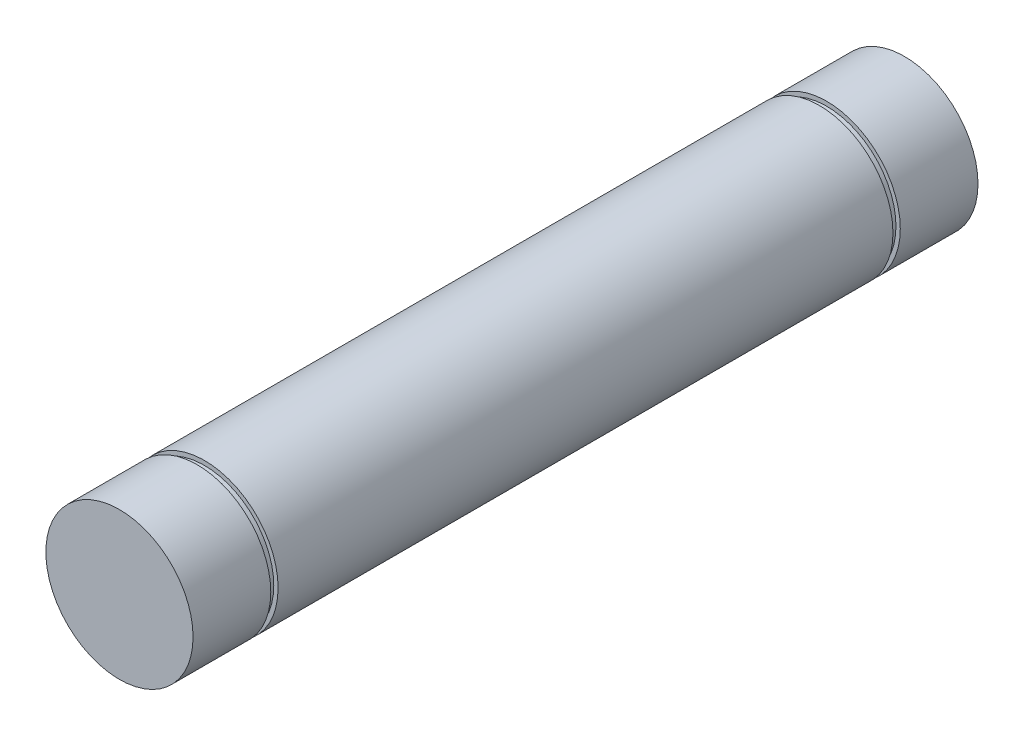
ISO-10303-21;
HEADER;
FILE_DESCRIPTION(('STEP AP214'),'2;1');
FILE_NAME('part.step','',(''),(''),'','','');
FILE_SCHEMA(('AUTOMOTIVE_DESIGN { 1 0 10303 214 1 1 1 1 }'));
ENDSEC;
DATA;
#1=APPLICATION_CONTEXT('core data for automotive mechanical design processes');
#2=APPLICATION_PROTOCOL_DEFINITION('international standard','automotive_design',2000,#1);
#3=PRODUCT_CONTEXT('',#1,'mechanical');
#4=PRODUCT('Part','Part','',(#3));
#5=PRODUCT_RELATED_PRODUCT_CATEGORY('part','',(#4));
#6=PRODUCT_DEFINITION_FORMATION('','',#4);
#7=PRODUCT_DEFINITION_CONTEXT('part definition',#1,'design');
#8=PRODUCT_DEFINITION('design','',#6,#7);
#9=PRODUCT_DEFINITION_SHAPE('','',#8);
#10=(LENGTH_UNIT() NAMED_UNIT(*) SI_UNIT(.MILLI.,.METRE.));
#11=(NAMED_UNIT(*) PLANE_ANGLE_UNIT() SI_UNIT($,.RADIAN.));
#12=(NAMED_UNIT(*) SI_UNIT($,.STERADIAN.) SOLID_ANGLE_UNIT());
#13=UNCERTAINTY_MEASURE_WITH_UNIT(LENGTH_MEASURE(1.E-05),#10,'distance_accuracy_value','');
#14=(GEOMETRIC_REPRESENTATION_CONTEXT(3) GLOBAL_UNCERTAINTY_ASSIGNED_CONTEXT((#13)) GLOBAL_UNIT_ASSIGNED_CONTEXT((#10,
#11,#12)) REPRESENTATION_CONTEXT('',''));
#15=CARTESIAN_POINT('',(0.,0.,0.));
#16=DIRECTION('',(0.,0.,1.));
#17=DIRECTION('',(1.,0.,0.));
#18=AXIS2_PLACEMENT_3D('',#15,#16,#17);
#19=CARTESIAN_POINT('',(0.,0.,-76.2));
#20=DIRECTION('',(0.,0.,1.));
#21=DIRECTION('',(1.,0.,0.));
#22=AXIS2_PLACEMENT_3D('',#19,#20,#21);
#23=CYLINDRICAL_SURFACE('',#22,14.29004);
#24=CARTESIAN_POINT('',(0.,0.,59.69));
#25=DIRECTION('',(0.,0.,1.));
#26=DIRECTION('',(1.,0.,0.));
#27=AXIS2_PLACEMENT_3D('',#24,#25,#26);
#28=CIRCLE('',#27,14.29004);
#29=CARTESIAN_POINT('',(14.29004,0.,59.69));
#30=VERTEX_POINT('',#29);
#31=EDGE_CURVE('E57',#30,#30,#28,.T.);
#32=CARTESIAN_POINT('',(0.,0.,-59.69));
#33=DIRECTION('',(0.,0.,1.));
#34=DIRECTION('',(1.,0.,0.));
#35=AXIS2_PLACEMENT_3D('',#32,#33,#34);
#36=CIRCLE('',#35,14.29004);
#37=CARTESIAN_POINT('',(14.29004,0.,-59.69));
#38=VERTEX_POINT('',#37);
#39=EDGE_CURVE('E69',#38,#38,#36,.T.);
#40=CARTESIAN_POINT('',(14.29004,0.,59.69));
#41=CARTESIAN_POINT('',(14.29004,0.,58.4464583333333));
#42=CARTESIAN_POINT('',(14.29004,0.,57.2029166666667));
#43=CARTESIAN_POINT('',(14.29004,0.,54.7158333333333));
#44=CARTESIAN_POINT('',(14.29004,0.,53.4722916666666));
#45=CARTESIAN_POINT('',(14.29004,0.,50.9852083333333));
#46=CARTESIAN_POINT('',(14.29004,0.,49.7416666666666));
#47=CARTESIAN_POINT('',(14.29004,0.,47.2545833333333));
#48=CARTESIAN_POINT('',(14.29004,0.,46.0110416666667));
#49=CARTESIAN_POINT('',(14.29004,0.,43.5239583333333));
#50=CARTESIAN_POINT('',(14.29004,0.,42.2804166666667));
#51=CARTESIAN_POINT('',(14.29004,0.,39.7933333333333));
#52=CARTESIAN_POINT('',(14.29004,0.,38.5497916666666));
#53=CARTESIAN_POINT('',(14.29004,0.,36.0627083333333));
#54=CARTESIAN_POINT('',(14.29004,0.,34.8191666666667));
#55=CARTESIAN_POINT('',(14.29004,0.,32.3320833333333));
#56=CARTESIAN_POINT('',(14.29004,0.,31.0885416666667));
#57=CARTESIAN_POINT('',(14.29004,0.,28.6014583333333));
#58=CARTESIAN_POINT('',(14.29004,0.,27.3579166666667));
#59=CARTESIAN_POINT('',(14.29004,0.,24.8708333333333));
#60=CARTESIAN_POINT('',(14.29004,0.,23.6272916666667));
#61=CARTESIAN_POINT('',(14.29004,0.,21.1402083333333));
#62=CARTESIAN_POINT('',(14.29004,0.,19.8966666666667));
#63=CARTESIAN_POINT('',(14.29004,0.,17.4095833333333));
#64=CARTESIAN_POINT('',(14.29004,0.,16.1660416666667));
#65=CARTESIAN_POINT('',(14.29004,0.,13.6789583333333));
#66=CARTESIAN_POINT('',(14.29004,0.,12.4354166666667));
#67=CARTESIAN_POINT('',(14.29004,0.,9.94833333333332));
#68=CARTESIAN_POINT('',(14.29004,0.,8.70479166666666));
#69=CARTESIAN_POINT('',(14.29004,0.,6.21770833333332));
#70=CARTESIAN_POINT('',(14.29004,0.,4.97416666666665));
#71=CARTESIAN_POINT('',(14.29004,0.,2.48708333333332));
#72=CARTESIAN_POINT('',(14.29004,0.,1.24354166666665));
#73=CARTESIAN_POINT('',(14.29004,0.,-1.24354166666668));
#74=CARTESIAN_POINT('',(14.29004,0.,-2.48708333333335));
#75=CARTESIAN_POINT('',(14.29004,0.,-4.97416666666668));
#76=CARTESIAN_POINT('',(14.29004,0.,-6.21770833333335));
#77=CARTESIAN_POINT('',(14.29004,0.,-8.70479166666668));
#78=CARTESIAN_POINT('',(14.29004,0.,-9.94833333333335));
#79=CARTESIAN_POINT('',(14.29004,0.,-12.4354166666667));
#80=CARTESIAN_POINT('',(14.29004,0.,-13.6789583333333));
#81=CARTESIAN_POINT('',(14.29004,0.,-16.1660416666667));
#82=CARTESIAN_POINT('',(14.29004,0.,-17.4095833333333));
#83=CARTESIAN_POINT('',(14.29004,0.,-19.8966666666667));
#84=CARTESIAN_POINT('',(14.29004,0.,-21.1402083333333));
#85=CARTESIAN_POINT('',(14.29004,0.,-23.6272916666667));
#86=CARTESIAN_POINT('',(14.29004,0.,-24.8708333333333));
#87=CARTESIAN_POINT('',(14.29004,0.,-27.3579166666667));
#88=CARTESIAN_POINT('',(14.29004,0.,-28.6014583333333));
#89=CARTESIAN_POINT('',(14.29004,0.,-31.0885416666667));
#90=CARTESIAN_POINT('',(14.29004,0.,-32.3320833333333));
#91=CARTESIAN_POINT('',(14.29004,0.,-34.8191666666667));
#92=CARTESIAN_POINT('',(14.29004,0.,-36.0627083333333));
#93=CARTESIAN_POINT('',(14.29004,0.,-38.5497916666667));
#94=CARTESIAN_POINT('',(14.29004,0.,-39.7933333333333));
#95=CARTESIAN_POINT('',(14.29004,0.,-42.2804166666667));
#96=CARTESIAN_POINT('',(14.29004,0.,-43.5239583333333));
#97=CARTESIAN_POINT('',(14.29004,0.,-46.0110416666667));
#98=CARTESIAN_POINT('',(14.29004,0.,-47.2545833333333));
#99=CARTESIAN_POINT('',(14.29004,0.,-49.7416666666667));
#100=CARTESIAN_POINT('',(14.29004,0.,-50.9852083333333));
#101=CARTESIAN_POINT('',(14.29004,0.,-53.4722916666667));
#102=CARTESIAN_POINT('',(14.29004,0.,-54.7158333333333));
#103=CARTESIAN_POINT('',(14.29004,0.,-57.2029166666667));
#104=CARTESIAN_POINT('',(14.29004,0.,-58.4464583333333));
#105=CARTESIAN_POINT('',(14.29004,0.,-59.69));
#106=B_SPLINE_CURVE_WITH_KNOTS('',3,(#40,#41,#42,#43,#44,#45,#46,#47,#48,#49,#50,#51,#52,#53,
#54,#55,#56,#57,#58,#59,#60,#61,#62,#63,#64,#65,#66,#67,#68,#69,#70,#71,#72,#73,#74,#75,#76,#77,
#78,#79,#80,#81,#82,#83,#84,#85,#86,#87,#88,#89,#90,#91,#92,#93,#94,#95,#96,#97,#98,#99,#100,
#101,#102,#103,#104,#105),.UNSPECIFIED.,.F.,.F.,(4,2,2,2,2,2,2,2,2,2,2,2,2,2,2,2,2,2,2,2,2,2,2,
2,2,2,2,2,2,2,2,2,4),(0.,3.73062499999999,7.46125,11.191875,14.9225,18.653125,22.38375,
26.114375,29.845,33.575625,37.30625,41.036875,44.7675,48.498125,52.22875,55.959375,59.69,
63.420625,67.15125,70.881875,74.6125,78.343125,82.07375,85.804375,89.535,93.265625,96.99625,
100.726875,104.4575,108.188125,111.91875,115.649375,119.38),.UNSPECIFIED.);
#107=EDGE_CURVE('BSEAM39',#30,#38,#106,.T.);
#108=ORIENTED_EDGE('',*,*,#31,.F.);
#109=ORIENTED_EDGE('',*,*,#39,.T.);
#110=ORIENTED_EDGE('',*,*,#107,.T.);
#111=ORIENTED_EDGE('',*,*,#107,.F.);
#112=EDGE_LOOP('',(#108,#110,#109,#111));
#113=FACE_BOUND('',#112,.T.);
#114=ADVANCED_FACE('F39',(#113),#23,.T.);
#115=CARTESIAN_POINT('',(0.,0.,76.2));
#116=DIRECTION('',(0.,0.,1.));
#117=DIRECTION('',(1.,0.,0.));
#118=AXIS2_PLACEMENT_3D('',#115,#116,#117);
#119=CIRCLE('',#118,14.29004);
#120=CARTESIAN_POINT('',(14.29004,0.,76.2));
#121=VERTEX_POINT('',#120);
#122=EDGE_CURVE('E43',#121,#121,#119,.T.);
#123=CARTESIAN_POINT('',(0.,0.,61.1124));
#124=DIRECTION('',(0.,0.,1.));
#125=DIRECTION('',(1.,0.,0.));
#126=AXIS2_PLACEMENT_3D('',#123,#124,#125);
#127=CIRCLE('',#126,14.29004);
#128=CARTESIAN_POINT('',(14.29004,0.,61.1124));
#129=VERTEX_POINT('',#128);
#130=EDGE_CURVE('E60',#129,#129,#127,.T.);
#131=CARTESIAN_POINT('',(14.29004,0.,76.2));
#132=CARTESIAN_POINT('',(14.29004,0.,76.0428375));
#133=CARTESIAN_POINT('',(14.29004,0.,75.885675));
#134=CARTESIAN_POINT('',(14.29004,0.,75.57135));
#135=CARTESIAN_POINT('',(14.29004,0.,75.4141875));
#136=CARTESIAN_POINT('',(14.29004,0.,75.0998625));
#137=CARTESIAN_POINT('',(14.29004,0.,74.9427));
#138=CARTESIAN_POINT('',(14.29004,0.,74.628375));
#139=CARTESIAN_POINT('',(14.29004,0.,74.4712125));
#140=CARTESIAN_POINT('',(14.29004,0.,74.1568875));
#141=CARTESIAN_POINT('',(14.29004,0.,73.999725));
#142=CARTESIAN_POINT('',(14.29004,0.,73.6854));
#143=CARTESIAN_POINT('',(14.29004,0.,73.5282375));
#144=CARTESIAN_POINT('',(14.29004,0.,73.2139125));
#145=CARTESIAN_POINT('',(14.29004,0.,73.05675));
#146=CARTESIAN_POINT('',(14.29004,0.,72.742425));
#147=CARTESIAN_POINT('',(14.29004,0.,72.5852625));
#148=CARTESIAN_POINT('',(14.29004,0.,72.2709375));
#149=CARTESIAN_POINT('',(14.29004,0.,72.113775));
#150=CARTESIAN_POINT('',(14.29004,0.,71.79945));
#151=CARTESIAN_POINT('',(14.29004,0.,71.6422875));
#152=CARTESIAN_POINT('',(14.29004,0.,71.3279625));
#153=CARTESIAN_POINT('',(14.29004,0.,71.1708));
#154=CARTESIAN_POINT('',(14.29004,0.,70.856475));
#155=CARTESIAN_POINT('',(14.29004,0.,70.6993125));
#156=CARTESIAN_POINT('',(14.29004,0.,70.3849875));
#157=CARTESIAN_POINT('',(14.29004,0.,70.227825));
#158=CARTESIAN_POINT('',(14.29004,0.,69.9135));
#159=CARTESIAN_POINT('',(14.29004,0.,69.7563375));
#160=CARTESIAN_POINT('',(14.29004,0.,69.4420125));
#161=CARTESIAN_POINT('',(14.29004,0.,69.28485));
#162=CARTESIAN_POINT('',(14.29004,0.,68.970525));
#163=CARTESIAN_POINT('',(14.29004,0.,68.8133625));
#164=CARTESIAN_POINT('',(14.29004,0.,68.4990375));
#165=CARTESIAN_POINT('',(14.29004,0.,68.341875));
#166=CARTESIAN_POINT('',(14.29004,0.,68.02755));
#167=CARTESIAN_POINT('',(14.29004,0.,67.8703875));
#168=CARTESIAN_POINT('',(14.29004,0.,67.5560625));
#169=CARTESIAN_POINT('',(14.29004,0.,67.3989));
#170=CARTESIAN_POINT('',(14.29004,0.,67.084575));
#171=CARTESIAN_POINT('',(14.29004,0.,66.9274125));
#172=CARTESIAN_POINT('',(14.29004,0.,66.6130875));
#173=CARTESIAN_POINT('',(14.29004,0.,66.455925));
#174=CARTESIAN_POINT('',(14.29004,0.,66.1416));
#175=CARTESIAN_POINT('',(14.29004,0.,65.9844375));
#176=CARTESIAN_POINT('',(14.29004,0.,65.6701125));
#177=CARTESIAN_POINT('',(14.29004,0.,65.51295));
#178=CARTESIAN_POINT('',(14.29004,0.,65.198625));
#179=CARTESIAN_POINT('',(14.29004,0.,65.0414625));
#180=CARTESIAN_POINT('',(14.29004,0.,64.7271375));
#181=CARTESIAN_POINT('',(14.29004,0.,64.569975));
#182=CARTESIAN_POINT('',(14.29004,0.,64.25565));
#183=CARTESIAN_POINT('',(14.29004,0.,64.0984875));
#184=CARTESIAN_POINT('',(14.29004,0.,63.7841625));
#185=CARTESIAN_POINT('',(14.29004,0.,63.627));
#186=CARTESIAN_POINT('',(14.29004,0.,63.312675));
#187=CARTESIAN_POINT('',(14.29004,0.,63.1555125));
#188=CARTESIAN_POINT('',(14.29004,0.,62.8411875));
#189=CARTESIAN_POINT('',(14.29004,0.,62.684025));
#190=CARTESIAN_POINT('',(14.29004,0.,62.3697));
#191=CARTESIAN_POINT('',(14.29004,0.,62.2125375));
#192=CARTESIAN_POINT('',(14.29004,0.,61.8982125));
#193=CARTESIAN_POINT('',(14.29004,0.,61.74105));
#194=CARTESIAN_POINT('',(14.29004,0.,61.426725));
#195=CARTESIAN_POINT('',(14.29004,0.,61.2695625));
#196=CARTESIAN_POINT('',(14.29004,0.,61.1124));
#197=B_SPLINE_CURVE_WITH_KNOTS('',3,(#131,#132,#133,#134,#135,#136,#137,#138,#139,#140,#141,
#142,#143,#144,#145,#146,#147,#148,#149,#150,#151,#152,#153,#154,#155,#156,#157,#158,#159,#160,
#161,#162,#163,#164,#165,#166,#167,#168,#169,#170,#171,#172,#173,#174,#175,#176,#177,#178,#179,
#180,#181,#182,#183,#184,#185,#186,#187,#188,#189,#190,#191,#192,#193,#194,#195,#196),
.UNSPECIFIED.,.F.,.F.,(4,2,2,2,2,2,2,2,2,2,2,2,2,2,2,2,2,2,2,2,2,2,2,2,2,2,2,2,2,2,2,2,4),(0.,
0.471487500000006,0.942975000000013,1.41446249999999,1.88595,2.3574375,2.82892500000001,
3.30041250000002,3.77189999999999,4.2433875,4.71487500000001,5.18636250000001,5.65785000000002,
6.12933750000003,6.600825,7.07231250000001,7.54380000000002,8.01528750000002,8.48677500000003,
8.95826250000001,9.42975000000001,9.90123750000002,10.372725,10.8442125,11.3157,11.7871875,
12.258675,12.7301625,13.20165,13.6731375,14.144625,14.6161125,15.0876),.UNSPECIFIED.);
#198=EDGE_CURVE('BSEAM41',#121,#129,#197,.T.);
#199=ORIENTED_EDGE('',*,*,#122,.F.);
#200=ORIENTED_EDGE('',*,*,#130,.T.);
#201=ORIENTED_EDGE('',*,*,#198,.T.);
#202=ORIENTED_EDGE('',*,*,#198,.F.);
#203=EDGE_LOOP('',(#199,#201,#200,#202));
#204=FACE_BOUND('',#203,.T.);
#205=ADVANCED_FACE('F41',(#204),#23,.T.);
#206=CARTESIAN_POINT('',(0.,0.,76.2));
#207=DIRECTION('',(0.,0.,1.));
#208=DIRECTION('',(1.,0.,0.));
#209=AXIS2_PLACEMENT_3D('',#206,#207,#208);
#210=PLANE('',#209);
#211=ORIENTED_EDGE('',*,*,#122,.T.);
#212=EDGE_LOOP('',(#211));
#213=FACE_BOUND('',#212,.T.);
#214=ADVANCED_FACE('F90',(#213),#210,.T.);
#215=CARTESIAN_POINT('',(0.,14.29004,61.1124));
#216=DIRECTION('',(0.,0.,-1.));
#217=DIRECTION('',(-1.,0.,0.));
#218=AXIS2_PLACEMENT_3D('',#215,#216,#217);
#219=PLANE('',#218);
#220=CARTESIAN_POINT('',(0.,0.,61.1124));
#221=DIRECTION('',(0.,0.,1.));
#222=DIRECTION('',(1.,0.,0.));
#223=AXIS2_PLACEMENT_3D('',#220,#221,#222);
#224=CIRCLE('',#223,13.4493);
#225=CARTESIAN_POINT('',(13.4493,0.,61.1124));
#226=VERTEX_POINT('',#225);
#227=EDGE_CURVE('E50',#226,#226,#224,.T.);
#228=ORIENTED_EDGE('',*,*,#227,.T.);
#229=EDGE_LOOP('',(#228));
#230=FACE_BOUND('',#229,.T.);
#231=ORIENTED_EDGE('',*,*,#130,.F.);
#232=EDGE_LOOP('',(#231));
#233=FACE_BOUND('',#232,.T.);
#234=ADVANCED_FACE('F95',(#230,#233),#219,.T.);
#235=CARTESIAN_POINT('',(0.,0.,76.2));
#236=DIRECTION('',(0.,0.,1.));
#237=DIRECTION('',(1.,0.,0.));
#238=AXIS2_PLACEMENT_3D('',#235,#236,#237);
#239=CYLINDRICAL_SURFACE('',#238,13.4493);
#240=CARTESIAN_POINT('',(0.,0.,59.69));
#241=DIRECTION('',(0.,0.,1.));
#242=DIRECTION('',(1.,0.,0.));
#243=AXIS2_PLACEMENT_3D('',#240,#241,#242);
#244=CIRCLE('',#243,13.4493);
#245=CARTESIAN_POINT('',(13.4493,0.,59.69));
#246=VERTEX_POINT('',#245);
#247=EDGE_CURVE('E54',#246,#246,#244,.T.);
#248=ORIENTED_EDGE('',*,*,#247,.T.);
#249=EDGE_LOOP('',(#248));
#250=FACE_BOUND('',#249,.T.);
#251=ORIENTED_EDGE('',*,*,#227,.F.);
#252=EDGE_LOOP('',(#251));
#253=FACE_BOUND('',#252,.T.);
#254=ADVANCED_FACE('F102',(#250,#253),#239,.T.);
#255=CARTESIAN_POINT('',(0.,14.29004,59.69));
#256=DIRECTION('',(0.,0.,1.));
#257=DIRECTION('',(1.,0.,0.));
#258=AXIS2_PLACEMENT_3D('',#255,#256,#257);
#259=PLANE('',#258);
#260=ORIENTED_EDGE('',*,*,#31,.T.);
#261=EDGE_LOOP('',(#260));
#262=FACE_BOUND('',#261,.T.);
#263=ORIENTED_EDGE('',*,*,#247,.F.);
#264=EDGE_LOOP('',(#263));
#265=FACE_BOUND('',#264,.T.);
#266=ADVANCED_FACE('F108',(#262,#265),#259,.T.);
#267=CARTESIAN_POINT('',(0.,14.29004,-61.1124));
#268=DIRECTION('',(0.,0.,1.));
#269=DIRECTION('',(-1.,0.,0.));
#270=AXIS2_PLACEMENT_3D('',#267,#268,#269);
#271=PLANE('',#270);
#272=CARTESIAN_POINT('',(0.,0.,-61.1124));
#273=DIRECTION('',(0.,0.,1.));
#274=DIRECTION('',(1.,0.,0.));
#275=AXIS2_PLACEMENT_3D('',#272,#273,#274);
#276=CIRCLE('',#275,13.4493);
#277=CARTESIAN_POINT('',(13.4493,0.,-61.1124));
#278=VERTEX_POINT('',#277);
#279=EDGE_CURVE('E63',#278,#278,#276,.T.);
#280=ORIENTED_EDGE('',*,*,#279,.F.);
#281=EDGE_LOOP('',(#280));
#282=FACE_BOUND('',#281,.T.);
#283=CARTESIAN_POINT('',(0.,0.,-61.1124));
#284=DIRECTION('',(0.,0.,1.));
#285=DIRECTION('',(1.,0.,0.));
#286=AXIS2_PLACEMENT_3D('',#283,#284,#285);
#287=CIRCLE('',#286,14.29004);
#288=CARTESIAN_POINT('',(14.29004,0.,-61.1124));
#289=VERTEX_POINT('',#288);
#290=EDGE_CURVE('E72',#289,#289,#287,.T.);
#291=ORIENTED_EDGE('',*,*,#290,.T.);
#292=EDGE_LOOP('',(#291));
#293=FACE_BOUND('',#292,.T.);
#294=ADVANCED_FACE('F76',(#282,#293),#271,.T.);
#295=CARTESIAN_POINT('',(0.,0.,-76.2));
#296=DIRECTION('',(0.,0.,-1.));
#297=DIRECTION('',(1.,0.,0.));
#298=AXIS2_PLACEMENT_3D('',#295,#296,#297);
#299=CYLINDRICAL_SURFACE('',#298,13.4493);
#300=CARTESIAN_POINT('',(0.,0.,-59.69));
#301=DIRECTION('',(0.,0.,1.));
#302=DIRECTION('',(1.,0.,0.));
#303=AXIS2_PLACEMENT_3D('',#300,#301,#302);
#304=CIRCLE('',#303,13.4493);
#305=CARTESIAN_POINT('',(13.4493,0.,-59.69));
#306=VERTEX_POINT('',#305);
#307=EDGE_CURVE('E66',#306,#306,#304,.T.);
#308=ORIENTED_EDGE('',*,*,#307,.F.);
#309=EDGE_LOOP('',(#308));
#310=FACE_BOUND('',#309,.T.);
#311=ORIENTED_EDGE('',*,*,#279,.T.);
#312=EDGE_LOOP('',(#311));
#313=FACE_BOUND('',#312,.T.);
#314=ADVANCED_FACE('F117',(#310,#313),#299,.T.);
#315=CARTESIAN_POINT('',(0.,14.29004,-59.69));
#316=DIRECTION('',(0.,0.,-1.));
#317=DIRECTION('',(1.,0.,0.));
#318=AXIS2_PLACEMENT_3D('',#315,#316,#317);
#319=PLANE('',#318);
#320=ORIENTED_EDGE('',*,*,#39,.F.);
#321=EDGE_LOOP('',(#320));
#322=FACE_BOUND('',#321,.T.);
#323=ORIENTED_EDGE('',*,*,#307,.T.);
#324=EDGE_LOOP('',(#323));
#325=FACE_BOUND('',#324,.T.);
#326=ADVANCED_FACE('F84',(#322,#325),#319,.T.);
#327=CARTESIAN_POINT('',(0.,0.,-76.2));
#328=DIRECTION('',(0.,0.,1.));
#329=DIRECTION('',(1.,0.,0.));
#330=AXIS2_PLACEMENT_3D('',#327,#328,#329);
#331=PLANE('',#330);
#332=CARTESIAN_POINT('',(0.,0.,-76.2));
#333=DIRECTION('',(0.,0.,1.));
#334=DIRECTION('',(1.,0.,0.));
#335=AXIS2_PLACEMENT_3D('',#332,#333,#334);
#336=CIRCLE('',#335,14.29004);
#337=CARTESIAN_POINT('',(14.29004,0.,-76.2));
#338=VERTEX_POINT('',#337);
#339=EDGE_CURVE('E10',#338,#338,#336,.T.);
#340=ORIENTED_EDGE('',*,*,#339,.F.);
#341=EDGE_LOOP('',(#340));
#342=FACE_BOUND('',#341,.T.);
#343=ADVANCED_FACE('F80',(#342),#331,.F.);
#344=CARTESIAN_POINT('',(14.29004,0.,-76.2));
#345=CARTESIAN_POINT('',(14.29004,0.,-76.0428375));
#346=CARTESIAN_POINT('',(14.29004,0.,-75.885675));
#347=CARTESIAN_POINT('',(14.29004,0.,-75.57135));
#348=CARTESIAN_POINT('',(14.29004,0.,-75.4141875));
#349=CARTESIAN_POINT('',(14.29004,0.,-75.0998625));
#350=CARTESIAN_POINT('',(14.29004,0.,-74.9427));
#351=CARTESIAN_POINT('',(14.29004,0.,-74.628375));
#352=CARTESIAN_POINT('',(14.29004,0.,-74.4712125));
#353=CARTESIAN_POINT('',(14.29004,0.,-74.1568875));
#354=CARTESIAN_POINT('',(14.29004,0.,-73.999725));
#355=CARTESIAN_POINT('',(14.29004,0.,-73.6854));
#356=CARTESIAN_POINT('',(14.29004,0.,-73.5282375));
#357=CARTESIAN_POINT('',(14.29004,0.,-73.2139125));
#358=CARTESIAN_POINT('',(14.29004,0.,-73.05675));
#359=CARTESIAN_POINT('',(14.29004,0.,-72.742425));
#360=CARTESIAN_POINT('',(14.29004,0.,-72.5852625));
#361=CARTESIAN_POINT('',(14.29004,0.,-72.2709375));
#362=CARTESIAN_POINT('',(14.29004,0.,-72.113775));
#363=CARTESIAN_POINT('',(14.29004,0.,-71.79945));
#364=CARTESIAN_POINT('',(14.29004,0.,-71.6422875));
#365=CARTESIAN_POINT('',(14.29004,0.,-71.3279625));
#366=CARTESIAN_POINT('',(14.29004,0.,-71.1708));
#367=CARTESIAN_POINT('',(14.29004,0.,-70.856475));
#368=CARTESIAN_POINT('',(14.29004,0.,-70.6993125));
#369=CARTESIAN_POINT('',(14.29004,0.,-70.3849875));
#370=CARTESIAN_POINT('',(14.29004,0.,-70.227825));
#371=CARTESIAN_POINT('',(14.29004,0.,-69.9135));
#372=CARTESIAN_POINT('',(14.29004,0.,-69.7563375));
#373=CARTESIAN_POINT('',(14.29004,0.,-69.4420125));
#374=CARTESIAN_POINT('',(14.29004,0.,-69.28485));
#375=CARTESIAN_POINT('',(14.29004,0.,-68.970525));
#376=CARTESIAN_POINT('',(14.29004,0.,-68.8133625));
#377=CARTESIAN_POINT('',(14.29004,0.,-68.4990375));
#378=CARTESIAN_POINT('',(14.29004,0.,-68.341875));
#379=CARTESIAN_POINT('',(14.29004,0.,-68.02755));
#380=CARTESIAN_POINT('',(14.29004,0.,-67.8703875));
#381=CARTESIAN_POINT('',(14.29004,0.,-67.5560625));
#382=CARTESIAN_POINT('',(14.29004,0.,-67.3989));
#383=CARTESIAN_POINT('',(14.29004,0.,-67.084575));
#384=CARTESIAN_POINT('',(14.29004,0.,-66.9274125));
#385=CARTESIAN_POINT('',(14.29004,0.,-66.6130875));
#386=CARTESIAN_POINT('',(14.29004,0.,-66.455925));
#387=CARTESIAN_POINT('',(14.29004,0.,-66.1416));
#388=CARTESIAN_POINT('',(14.29004,0.,-65.9844375));
#389=CARTESIAN_POINT('',(14.29004,0.,-65.6701125));
#390=CARTESIAN_POINT('',(14.29004,0.,-65.51295));
#391=CARTESIAN_POINT('',(14.29004,0.,-65.198625));
#392=CARTESIAN_POINT('',(14.29004,0.,-65.0414625));
#393=CARTESIAN_POINT('',(14.29004,0.,-64.7271375));
#394=CARTESIAN_POINT('',(14.29004,0.,-64.569975));
#395=CARTESIAN_POINT('',(14.29004,0.,-64.25565));
#396=CARTESIAN_POINT('',(14.29004,0.,-64.0984875));
#397=CARTESIAN_POINT('',(14.29004,0.,-63.7841625));
#398=CARTESIAN_POINT('',(14.29004,0.,-63.627));
#399=CARTESIAN_POINT('',(14.29004,0.,-63.312675));
#400=CARTESIAN_POINT('',(14.29004,0.,-63.1555125));
#401=CARTESIAN_POINT('',(14.29004,0.,-62.8411875));
#402=CARTESIAN_POINT('',(14.29004,0.,-62.684025));
#403=CARTESIAN_POINT('',(14.29004,0.,-62.3697));
#404=CARTESIAN_POINT('',(14.29004,0.,-62.2125375));
#405=CARTESIAN_POINT('',(14.29004,0.,-61.8982125));
#406=CARTESIAN_POINT('',(14.29004,0.,-61.74105));
#407=CARTESIAN_POINT('',(14.29004,0.,-61.426725));
#408=CARTESIAN_POINT('',(14.29004,0.,-61.2695625));
#409=CARTESIAN_POINT('',(14.29004,0.,-61.1124));
#410=B_SPLINE_CURVE_WITH_KNOTS('',3,(#344,#345,#346,#347,#348,#349,#350,#351,#352,#353,#354,
#355,#356,#357,#358,#359,#360,#361,#362,#363,#364,#365,#366,#367,#368,#369,#370,#371,#372,#373,
#374,#375,#376,#377,#378,#379,#380,#381,#382,#383,#384,#385,#386,#387,#388,#389,#390,#391,#392,
#393,#394,#395,#396,#397,#398,#399,#400,#401,#402,#403,#404,#405,#406,#407,#408,#409),
.UNSPECIFIED.,.F.,.F.,(4,2,2,2,2,2,2,2,2,2,2,2,2,2,2,2,2,2,2,2,2,2,2,2,2,2,2,2,2,2,2,2,4),(0.,
0.471487500000006,0.942975000000013,1.4144625,1.88595000000001,2.3574375,2.82892500000001,
3.3004125,3.77190000000001,4.24338750000001,4.71487500000001,5.18636250000001,5.65785000000001,
6.12933750000001,6.600825,7.07231250000001,7.54380000000002,8.01528750000001,8.48677500000002,
8.95826250000001,9.42975000000001,9.90123750000001,10.372725,10.8442125,11.3157,11.7871875,
12.258675,12.7301625,13.20165,13.6731375,14.144625,14.6161125,15.0876),.UNSPECIFIED.);
#411=EDGE_CURVE('BSEAM78',#338,#289,#410,.T.);
#412=ORIENTED_EDGE('',*,*,#339,.T.);
#413=ORIENTED_EDGE('',*,*,#290,.F.);
#414=ORIENTED_EDGE('',*,*,#411,.T.);
#415=ORIENTED_EDGE('',*,*,#411,.F.);
#416=EDGE_LOOP('',(#412,#414,#413,#415));
#417=FACE_BOUND('',#416,.T.);
#418=ADVANCED_FACE('F78',(#417),#23,.T.);
#419=CLOSED_SHELL('',(#114,#205,#214,#234,#254,#266,#294,#314,#326,#343,#418));
#420=MANIFOLD_SOLID_BREP('B2',#419);
#421=ADVANCED_BREP_SHAPE_REPRESENTATION('',(#18,#420),#14);
#422=SHAPE_DEFINITION_REPRESENTATION(#9,#421);
ENDSEC;
END-ISO-10303-21;
